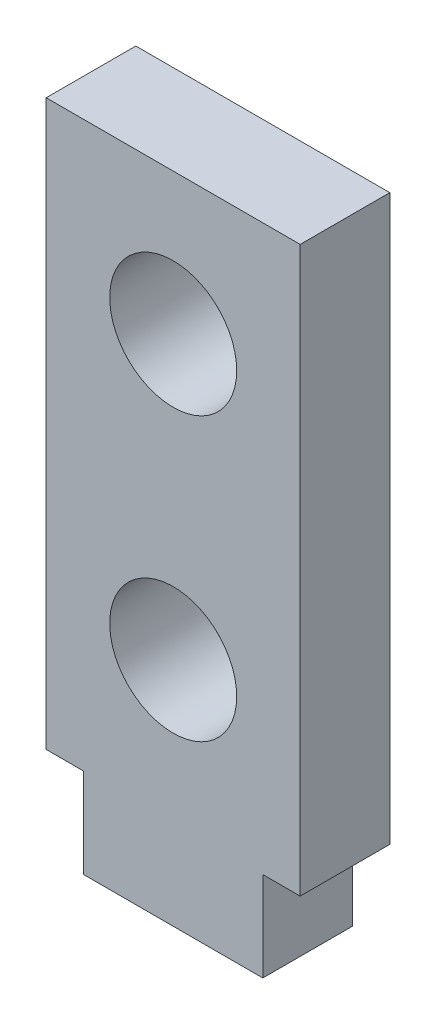
ISO-10303-21;
HEADER;
FILE_DESCRIPTION(('STEP AP214'),'2;1');
FILE_NAME('part.step','',(''),(''),'','','');
FILE_SCHEMA(('AUTOMOTIVE_DESIGN { 1 0 10303 214 1 1 1 1 }'));
ENDSEC;
DATA;
#1=APPLICATION_CONTEXT('core data for automotive mechanical design processes');
#2=APPLICATION_PROTOCOL_DEFINITION('international standard','automotive_design',2000,#1);
#3=PRODUCT_CONTEXT('',#1,'mechanical');
#4=PRODUCT('Part','Part','',(#3));
#5=PRODUCT_RELATED_PRODUCT_CATEGORY('part','',(#4));
#6=PRODUCT_DEFINITION_FORMATION('','',#4);
#7=PRODUCT_DEFINITION_CONTEXT('part definition',#1,'design');
#8=PRODUCT_DEFINITION('design','',#6,#7);
#9=PRODUCT_DEFINITION_SHAPE('','',#8);
#10=(LENGTH_UNIT() NAMED_UNIT(*) SI_UNIT(.MILLI.,.METRE.));
#11=(NAMED_UNIT(*) PLANE_ANGLE_UNIT() SI_UNIT($,.RADIAN.));
#12=(NAMED_UNIT(*) SI_UNIT($,.STERADIAN.) SOLID_ANGLE_UNIT());
#13=UNCERTAINTY_MEASURE_WITH_UNIT(LENGTH_MEASURE(1.E-05),#10,'distance_accuracy_value','');
#14=(GEOMETRIC_REPRESENTATION_CONTEXT(3) GLOBAL_UNCERTAINTY_ASSIGNED_CONTEXT((#13)) GLOBAL_UNIT_ASSIGNED_CONTEXT((#10,
#11,#12)) REPRESENTATION_CONTEXT('',''));
#15=CARTESIAN_POINT('',(0.,0.,0.));
#16=DIRECTION('',(0.,0.,1.));
#17=DIRECTION('',(1.,0.,0.));
#18=AXIS2_PLACEMENT_3D('',#15,#16,#17);
#19=CARTESIAN_POINT('',(0.,20.,3.175));
#20=DIRECTION('',(0.,0.,-1.));
#21=DIRECTION('',(-1.,0.,0.));
#22=AXIS2_PLACEMENT_3D('',#19,#20,#21);
#23=PLANE('',#22);
#24=CARTESIAN_POINT('',(4.5,5.,3.175));
#25=DIRECTION('',(0.,0.,1.));
#26=DIRECTION('',(1.,0.,0.));
#27=AXIS2_PLACEMENT_3D('',#24,#25,#26);
#28=CIRCLE('',#27,2.25);
#29=CARTESIAN_POINT('',(6.75,5.,3.175));
#30=VERTEX_POINT('',#29);
#31=EDGE_CURVE('E134',#30,#30,#28,.T.);
#32=ORIENTED_EDGE('',*,*,#31,.F.);
#33=EDGE_LOOP('',(#32));
#34=FACE_BOUND('',#33,.T.);
#35=DIRECTION('',(0.,-1.,0.));
#36=VECTOR('',#35,1.);
#37=CARTESIAN_POINT('',(0.,0.,3.175));
#38=LINE('',#37,#36);
#39=CARTESIAN_POINT('',(0.,20.,3.175));
#40=VERTEX_POINT('',#39);
#41=CARTESIAN_POINT('',(0.,0.,3.175));
#42=VERTEX_POINT('',#41);
#43=EDGE_CURVE('E145',#40,#42,#38,.T.);
#44=ORIENTED_EDGE('',*,*,#43,.T.);
#45=DIRECTION('',(1.,0.,0.));
#46=VECTOR('',#45,1.);
#47=CARTESIAN_POINT('',(0.,0.,3.175));
#48=LINE('',#47,#46);
#49=CARTESIAN_POINT('',(1.325,0.,3.175));
#50=VERTEX_POINT('',#49);
#51=EDGE_CURVE('E93',#42,#50,#48,.T.);
#52=ORIENTED_EDGE('',*,*,#51,.T.);
#53=DIRECTION('',(0.,-1.,0.));
#54=VECTOR('',#53,1.);
#55=CARTESIAN_POINT('',(1.325,0.,3.175));
#56=LINE('',#55,#54);
#57=CARTESIAN_POINT('',(1.325,-3.175,3.175));
#58=VERTEX_POINT('',#57);
#59=EDGE_CURVE('E160',#50,#58,#56,.T.);
#60=ORIENTED_EDGE('',*,*,#59,.T.);
#61=DIRECTION('',(1.,0.,0.));
#62=VECTOR('',#61,1.);
#63=CARTESIAN_POINT('',(1.325,-3.175,3.175));
#64=LINE('',#63,#62);
#65=CARTESIAN_POINT('',(7.675,-3.175,3.175));
#66=VERTEX_POINT('',#65);
#67=EDGE_CURVE('E173',#58,#66,#64,.T.);
#68=ORIENTED_EDGE('',*,*,#67,.T.);
#69=DIRECTION('',(0.,1.,0.));
#70=VECTOR('',#69,1.);
#71=CARTESIAN_POINT('',(7.675,-3.175,3.175));
#72=LINE('',#71,#70);
#73=CARTESIAN_POINT('',(7.675,0.,3.175));
#74=VERTEX_POINT('',#73);
#75=EDGE_CURVE('E112',#66,#74,#72,.T.);
#76=ORIENTED_EDGE('',*,*,#75,.T.);
#77=DIRECTION('',(1.,0.,0.));
#78=VECTOR('',#77,1.);
#79=CARTESIAN_POINT('',(7.675,0.,3.175));
#80=LINE('',#79,#78);
#81=CARTESIAN_POINT('',(9.,0.,3.175));
#82=VERTEX_POINT('',#81);
#83=EDGE_CURVE('E106',#74,#82,#80,.T.);
#84=ORIENTED_EDGE('',*,*,#83,.T.);
#85=DIRECTION('',(0.,1.,0.));
#86=VECTOR('',#85,1.);
#87=CARTESIAN_POINT('',(9.,0.,3.175));
#88=LINE('',#87,#86);
#89=CARTESIAN_POINT('',(9.,20.,3.175));
#90=VERTEX_POINT('',#89);
#91=EDGE_CURVE('E110',#82,#90,#88,.T.);
#92=ORIENTED_EDGE('',*,*,#91,.T.);
#93=DIRECTION('',(-1.,0.,0.));
#94=VECTOR('',#93,1.);
#95=CARTESIAN_POINT('',(0.,20.,3.175));
#96=LINE('',#95,#94);
#97=EDGE_CURVE('E50',#90,#40,#96,.T.);
#98=ORIENTED_EDGE('',*,*,#97,.T.);
#99=EDGE_LOOP('',(#44,#52,#60,#68,#76,#84,#92,#98));
#100=FACE_BOUND('',#99,.T.);
#101=CARTESIAN_POINT('',(4.5,15.,3.175));
#102=DIRECTION('',(0.,0.,1.));
#103=DIRECTION('',(1.,0.,0.));
#104=AXIS2_PLACEMENT_3D('',#101,#102,#103);
#105=CIRCLE('',#104,2.25);
#106=CARTESIAN_POINT('',(6.75,15.,3.175));
#107=VERTEX_POINT('',#106);
#108=EDGE_CURVE('E182',#107,#107,#105,.T.);
#109=ORIENTED_EDGE('',*,*,#108,.F.);
#110=EDGE_LOOP('',(#109));
#111=FACE_BOUND('',#110,.T.);
#112=ADVANCED_FACE('F33',(#34,#100,#111),#23,.F.);
#113=CARTESIAN_POINT('',(0.,20.,0.));
#114=DIRECTION('',(0.,0.,-1.));
#115=DIRECTION('',(-1.,0.,0.));
#116=AXIS2_PLACEMENT_3D('',#113,#114,#115);
#117=PLANE('',#116);
#118=CARTESIAN_POINT('',(4.5,5.,0.));
#119=DIRECTION('',(0.,0.,1.));
#120=DIRECTION('',(1.,0.,0.));
#121=AXIS2_PLACEMENT_3D('',#118,#119,#120);
#122=CIRCLE('',#121,2.25);
#123=CARTESIAN_POINT('',(6.75,5.,0.));
#124=VERTEX_POINT('',#123);
#125=EDGE_CURVE('E179',#124,#124,#122,.T.);
#126=ORIENTED_EDGE('',*,*,#125,.T.);
#127=EDGE_LOOP('',(#126));
#128=FACE_BOUND('',#127,.T.);
#129=DIRECTION('',(0.,-1.,0.));
#130=VECTOR('',#129,1.);
#131=CARTESIAN_POINT('',(0.,0.,0.));
#132=LINE('',#131,#130);
#133=CARTESIAN_POINT('',(0.,20.,0.));
#134=VERTEX_POINT('',#133);
#135=CARTESIAN_POINT('',(0.,0.,0.));
#136=VERTEX_POINT('',#135);
#137=EDGE_CURVE('E130',#134,#136,#132,.T.);
#138=ORIENTED_EDGE('',*,*,#137,.F.);
#139=DIRECTION('',(-1.,0.,0.));
#140=VECTOR('',#139,1.);
#141=CARTESIAN_POINT('',(0.,20.,0.));
#142=LINE('',#141,#140);
#143=CARTESIAN_POINT('',(9.,20.,0.));
#144=VERTEX_POINT('',#143);
#145=EDGE_CURVE('E85',#144,#134,#142,.T.);
#146=ORIENTED_EDGE('',*,*,#145,.F.);
#147=DIRECTION('',(0.,1.,0.));
#148=VECTOR('',#147,1.);
#149=CARTESIAN_POINT('',(9.,0.,0.));
#150=LINE('',#149,#148);
#151=CARTESIAN_POINT('',(9.,0.,0.));
#152=VERTEX_POINT('',#151);
#153=EDGE_CURVE('E79',#152,#144,#150,.T.);
#154=ORIENTED_EDGE('',*,*,#153,.F.);
#155=DIRECTION('',(1.,0.,0.));
#156=VECTOR('',#155,1.);
#157=CARTESIAN_POINT('',(7.675,0.,0.));
#158=LINE('',#157,#156);
#159=CARTESIAN_POINT('',(7.675,0.,0.));
#160=VERTEX_POINT('',#159);
#161=EDGE_CURVE('E120',#160,#152,#158,.T.);
#162=ORIENTED_EDGE('',*,*,#161,.F.);
#163=DIRECTION('',(0.,1.,0.));
#164=VECTOR('',#163,1.);
#165=CARTESIAN_POINT('',(7.675,-3.175,0.));
#166=LINE('',#165,#164);
#167=CARTESIAN_POINT('',(7.675,-3.175,0.));
#168=VERTEX_POINT('',#167);
#169=EDGE_CURVE('E140',#168,#160,#166,.T.);
#170=ORIENTED_EDGE('',*,*,#169,.F.);
#171=DIRECTION('',(1.,0.,0.));
#172=VECTOR('',#171,1.);
#173=CARTESIAN_POINT('',(1.325,-3.175,0.));
#174=LINE('',#173,#172);
#175=CARTESIAN_POINT('',(1.325,-3.175,0.));
#176=VERTEX_POINT('',#175);
#177=EDGE_CURVE('E138',#176,#168,#174,.T.);
#178=ORIENTED_EDGE('',*,*,#177,.F.);
#179=DIRECTION('',(0.,-1.,0.));
#180=VECTOR('',#179,1.);
#181=CARTESIAN_POINT('',(1.325,0.,0.));
#182=LINE('',#181,#180);
#183=CARTESIAN_POINT('',(1.325,0.,0.));
#184=VERTEX_POINT('',#183);
#185=EDGE_CURVE('E136',#184,#176,#182,.T.);
#186=ORIENTED_EDGE('',*,*,#185,.F.);
#187=DIRECTION('',(1.,0.,0.));
#188=VECTOR('',#187,1.);
#189=CARTESIAN_POINT('',(0.,0.,0.));
#190=LINE('',#189,#188);
#191=EDGE_CURVE('E133',#136,#184,#190,.T.);
#192=ORIENTED_EDGE('',*,*,#191,.F.);
#193=EDGE_LOOP('',(#138,#146,#154,#162,#170,#178,#186,#192));
#194=FACE_BOUND('',#193,.T.);
#195=CARTESIAN_POINT('',(4.5,15.,0.));
#196=DIRECTION('',(0.,0.,1.));
#197=DIRECTION('',(1.,0.,0.));
#198=AXIS2_PLACEMENT_3D('',#195,#196,#197);
#199=CIRCLE('',#198,2.25);
#200=CARTESIAN_POINT('',(6.75,15.,0.));
#201=VERTEX_POINT('',#200);
#202=EDGE_CURVE('E185',#201,#201,#199,.T.);
#203=ORIENTED_EDGE('',*,*,#202,.T.);
#204=EDGE_LOOP('',(#203));
#205=FACE_BOUND('',#204,.T.);
#206=ADVANCED_FACE('F164',(#128,#194,#205),#117,.T.);
#207=CARTESIAN_POINT('',(0.,0.,3.175));
#208=DIRECTION('',(1.,0.,0.));
#209=DIRECTION('',(0.,0.,-1.));
#210=AXIS2_PLACEMENT_3D('',#207,#208,#209);
#211=PLANE('',#210);
#212=ORIENTED_EDGE('',*,*,#137,.T.);
#213=DIRECTION('',(0.,0.,-1.));
#214=VECTOR('',#213,1.);
#215=CARTESIAN_POINT('',(0.,0.,3.175));
#216=LINE('',#215,#214);
#217=EDGE_CURVE('E11',#42,#136,#216,.T.);
#218=ORIENTED_EDGE('',*,*,#217,.F.);
#219=ORIENTED_EDGE('',*,*,#43,.F.);
#220=DIRECTION('',(0.,0.,-1.));
#221=VECTOR('',#220,1.);
#222=CARTESIAN_POINT('',(0.,20.,3.175));
#223=LINE('',#222,#221);
#224=EDGE_CURVE('E126',#40,#134,#223,.T.);
#225=ORIENTED_EDGE('',*,*,#224,.T.);
#226=EDGE_LOOP('',(#212,#218,#219,#225));
#227=FACE_BOUND('',#226,.T.);
#228=ADVANCED_FACE('F35',(#227),#211,.F.);
#229=CARTESIAN_POINT('',(0.,0.,3.175));
#230=DIRECTION('',(0.,1.,0.));
#231=DIRECTION('',(0.,0.,1.));
#232=AXIS2_PLACEMENT_3D('',#229,#230,#231);
#233=PLANE('',#232);
#234=ORIENTED_EDGE('',*,*,#191,.T.);
#235=DIRECTION('',(0.,0.,-1.));
#236=VECTOR('',#235,1.);
#237=CARTESIAN_POINT('',(1.325,0.,3.175));
#238=LINE('',#237,#236);
#239=EDGE_CURVE('E42',#50,#184,#238,.T.);
#240=ORIENTED_EDGE('',*,*,#239,.F.);
#241=ORIENTED_EDGE('',*,*,#51,.F.);
#242=ORIENTED_EDGE('',*,*,#217,.T.);
#243=EDGE_LOOP('',(#234,#240,#241,#242));
#244=FACE_BOUND('',#243,.T.);
#245=ADVANCED_FACE('F218',(#244),#233,.F.);
#246=CARTESIAN_POINT('',(1.325,0.,3.175));
#247=DIRECTION('',(1.,0.,0.));
#248=DIRECTION('',(0.,1.,0.));
#249=AXIS2_PLACEMENT_3D('',#246,#247,#248);
#250=PLANE('',#249);
#251=ORIENTED_EDGE('',*,*,#185,.T.);
#252=DIRECTION('',(0.,0.,-1.));
#253=VECTOR('',#252,1.);
#254=CARTESIAN_POINT('',(1.325,-3.175,3.175));
#255=LINE('',#254,#253);
#256=EDGE_CURVE('E152',#58,#176,#255,.T.);
#257=ORIENTED_EDGE('',*,*,#256,.F.);
#258=ORIENTED_EDGE('',*,*,#59,.F.);
#259=ORIENTED_EDGE('',*,*,#239,.T.);
#260=EDGE_LOOP('',(#251,#257,#258,#259));
#261=FACE_BOUND('',#260,.T.);
#262=ADVANCED_FACE('F158',(#261),#250,.F.);
#263=CARTESIAN_POINT('',(1.325,-3.175,3.175));
#264=DIRECTION('',(0.,1.,0.));
#265=DIRECTION('',(0.,0.,1.));
#266=AXIS2_PLACEMENT_3D('',#263,#264,#265);
#267=PLANE('',#266);
#268=ORIENTED_EDGE('',*,*,#177,.T.);
#269=DIRECTION('',(0.,0.,-1.));
#270=VECTOR('',#269,1.);
#271=CARTESIAN_POINT('',(7.675,-3.175,3.175));
#272=LINE('',#271,#270);
#273=EDGE_CURVE('E149',#66,#168,#272,.T.);
#274=ORIENTED_EDGE('',*,*,#273,.F.);
#275=ORIENTED_EDGE('',*,*,#67,.F.);
#276=ORIENTED_EDGE('',*,*,#256,.T.);
#277=EDGE_LOOP('',(#268,#274,#275,#276));
#278=FACE_BOUND('',#277,.T.);
#279=ADVANCED_FACE('F169',(#278),#267,.F.);
#280=CARTESIAN_POINT('',(7.675,-3.175,3.175));
#281=DIRECTION('',(-1.,0.,0.));
#282=DIRECTION('',(0.,0.,1.));
#283=AXIS2_PLACEMENT_3D('',#280,#281,#282);
#284=PLANE('',#283);
#285=ORIENTED_EDGE('',*,*,#169,.T.);
#286=DIRECTION('',(0.,0.,-1.));
#287=VECTOR('',#286,1.);
#288=CARTESIAN_POINT('',(7.675,0.,3.175));
#289=LINE('',#288,#287);
#290=EDGE_CURVE('E121',#74,#160,#289,.T.);
#291=ORIENTED_EDGE('',*,*,#290,.F.);
#292=ORIENTED_EDGE('',*,*,#75,.F.);
#293=ORIENTED_EDGE('',*,*,#273,.T.);
#294=EDGE_LOOP('',(#285,#291,#292,#293));
#295=FACE_BOUND('',#294,.T.);
#296=ADVANCED_FACE('F172',(#295),#284,.F.);
#297=CARTESIAN_POINT('',(7.675,0.,3.175));
#298=DIRECTION('',(0.,1.,0.));
#299=DIRECTION('',(-1.,0.,0.));
#300=AXIS2_PLACEMENT_3D('',#297,#298,#299);
#301=PLANE('',#300);
#302=ORIENTED_EDGE('',*,*,#161,.T.);
#303=DIRECTION('',(0.,0.,-1.));
#304=VECTOR('',#303,1.);
#305=CARTESIAN_POINT('',(9.,0.,3.175));
#306=LINE('',#305,#304);
#307=EDGE_CURVE('E117',#82,#152,#306,.T.);
#308=ORIENTED_EDGE('',*,*,#307,.F.);
#309=ORIENTED_EDGE('',*,*,#83,.F.);
#310=ORIENTED_EDGE('',*,*,#290,.T.);
#311=EDGE_LOOP('',(#302,#308,#309,#310));
#312=FACE_BOUND('',#311,.T.);
#313=ADVANCED_FACE('F118',(#312),#301,.F.);
#314=CARTESIAN_POINT('',(9.,0.,3.175));
#315=DIRECTION('',(-1.,0.,0.));
#316=DIRECTION('',(0.,0.,1.));
#317=AXIS2_PLACEMENT_3D('',#314,#315,#316);
#318=PLANE('',#317);
#319=ORIENTED_EDGE('',*,*,#153,.T.);
#320=DIRECTION('',(0.,0.,-1.));
#321=VECTOR('',#320,1.);
#322=CARTESIAN_POINT('',(9.,20.,3.175));
#323=LINE('',#322,#321);
#324=EDGE_CURVE('E122',#90,#144,#323,.T.);
#325=ORIENTED_EDGE('',*,*,#324,.F.);
#326=ORIENTED_EDGE('',*,*,#91,.F.);
#327=ORIENTED_EDGE('',*,*,#307,.T.);
#328=EDGE_LOOP('',(#319,#325,#326,#327));
#329=FACE_BOUND('',#328,.T.);
#330=ADVANCED_FACE('F124',(#329),#318,.F.);
#331=CARTESIAN_POINT('',(0.,20.,3.175));
#332=DIRECTION('',(0.,-1.,0.));
#333=DIRECTION('',(0.,0.,-1.));
#334=AXIS2_PLACEMENT_3D('',#331,#332,#333);
#335=PLANE('',#334);
#336=ORIENTED_EDGE('',*,*,#145,.T.);
#337=ORIENTED_EDGE('',*,*,#224,.F.);
#338=ORIENTED_EDGE('',*,*,#97,.F.);
#339=ORIENTED_EDGE('',*,*,#324,.T.);
#340=EDGE_LOOP('',(#336,#337,#338,#339));
#341=FACE_BOUND('',#340,.T.);
#342=ADVANCED_FACE('F206',(#341),#335,.F.);
#343=CARTESIAN_POINT('',(4.5,5.,3.175));
#344=DIRECTION('',(0.,0.,-1.));
#345=DIRECTION('',(-1.,0.,0.));
#346=AXIS2_PLACEMENT_3D('',#343,#344,#345);
#347=CYLINDRICAL_SURFACE('',#346,2.25);
#348=ORIENTED_EDGE('',*,*,#31,.T.);
#349=EDGE_LOOP('',(#348));
#350=FACE_BOUND('',#349,.T.);
#351=ORIENTED_EDGE('',*,*,#125,.F.);
#352=EDGE_LOOP('',(#351));
#353=FACE_BOUND('',#352,.T.);
#354=ADVANCED_FACE('F203',(#350,#353),#347,.F.);
#355=CARTESIAN_POINT('',(4.5,15.,3.175));
#356=DIRECTION('',(0.,0.,-1.));
#357=DIRECTION('',(-1.,0.,0.));
#358=AXIS2_PLACEMENT_3D('',#355,#356,#357);
#359=CYLINDRICAL_SURFACE('',#358,2.25);
#360=ORIENTED_EDGE('',*,*,#108,.T.);
#361=EDGE_LOOP('',(#360));
#362=FACE_BOUND('',#361,.T.);
#363=ORIENTED_EDGE('',*,*,#202,.F.);
#364=EDGE_LOOP('',(#363));
#365=FACE_BOUND('',#364,.T.);
#366=ADVANCED_FACE('F191',(#362,#365),#359,.F.);
#367=CLOSED_SHELL('',(#112,#206,#228,#245,#262,#279,#296,#313,#330,#342,#354,#366));
#368=MANIFOLD_SOLID_BREP('B2',#367);
#369=ADVANCED_BREP_SHAPE_REPRESENTATION('',(#18,#368),#14);
#370=SHAPE_DEFINITION_REPRESENTATION(#9,#369);
ENDSEC;
END-ISO-10303-21;
